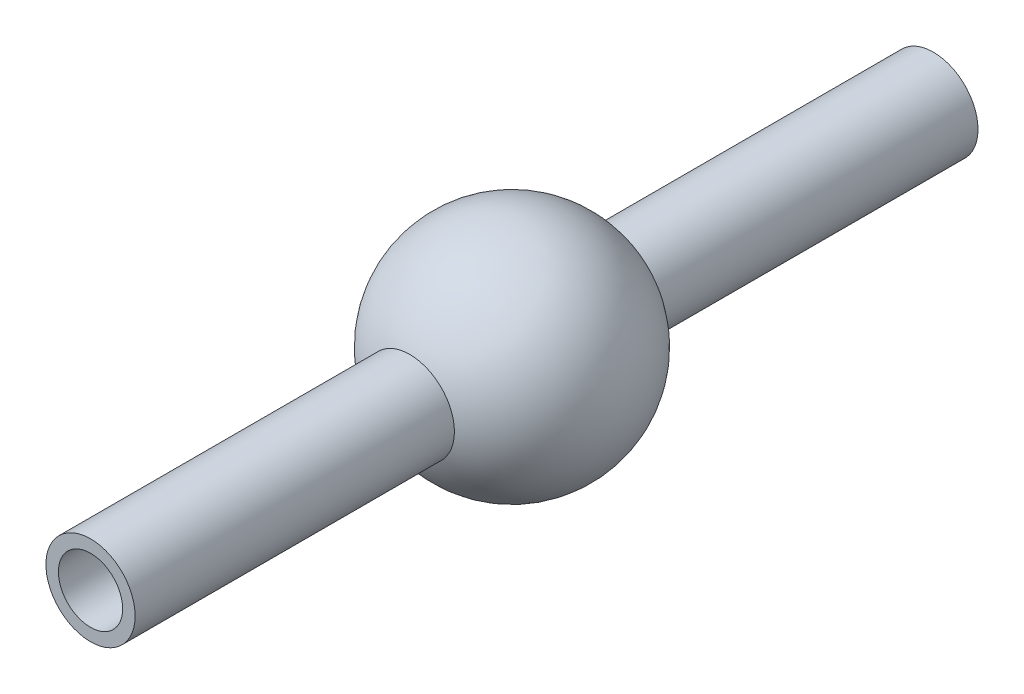
ISO-10303-21;
HEADER;
FILE_DESCRIPTION(('STEP AP214'),'2;1');
FILE_NAME('part.step','',(''),(''),'','','');
FILE_SCHEMA(('AUTOMOTIVE_DESIGN { 1 0 10303 214 1 1 1 1 }'));
ENDSEC;
DATA;
#1=APPLICATION_CONTEXT('core data for automotive mechanical design processes');
#2=APPLICATION_PROTOCOL_DEFINITION('international standard','automotive_design',2000,#1);
#3=PRODUCT_CONTEXT('',#1,'mechanical');
#4=PRODUCT('Part','Part','',(#3));
#5=PRODUCT_RELATED_PRODUCT_CATEGORY('part','',(#4));
#6=PRODUCT_DEFINITION_FORMATION('','',#4);
#7=PRODUCT_DEFINITION_CONTEXT('part definition',#1,'design');
#8=PRODUCT_DEFINITION('design','',#6,#7);
#9=PRODUCT_DEFINITION_SHAPE('','',#8);
#10=(LENGTH_UNIT() NAMED_UNIT(*) SI_UNIT(.MILLI.,.METRE.));
#11=(NAMED_UNIT(*) PLANE_ANGLE_UNIT() SI_UNIT($,.RADIAN.));
#12=(NAMED_UNIT(*) SI_UNIT($,.STERADIAN.) SOLID_ANGLE_UNIT());
#13=UNCERTAINTY_MEASURE_WITH_UNIT(LENGTH_MEASURE(1.E-05),#10,'distance_accuracy_value','');
#14=(GEOMETRIC_REPRESENTATION_CONTEXT(3) GLOBAL_UNCERTAINTY_ASSIGNED_CONTEXT((#13)) GLOBAL_UNIT_ASSIGNED_CONTEXT((#10,
#11,#12)) REPRESENTATION_CONTEXT('',''));
#15=CARTESIAN_POINT('',(0.,0.,0.));
#16=DIRECTION('',(0.,0.,1.));
#17=DIRECTION('',(1.,0.,0.));
#18=AXIS2_PLACEMENT_3D('',#15,#16,#17);
#19=CARTESIAN_POINT('',(0.,0.,-30.));
#20=DIRECTION('',(0.,0.,1.));
#21=DIRECTION('',(1.,0.,0.));
#22=AXIS2_PLACEMENT_3D('',#19,#20,#21);
#23=CYLINDRICAL_SURFACE('',#22,3.175);
#24=CARTESIAN_POINT('',(0.,0.,7.27211111026227));
#25=DIRECTION('',(0.,0.,-1.));
#26=DIRECTION('',(-1.,0.,0.));
#27=AXIS2_PLACEMENT_3D('',#24,#25,#26);
#28=CIRCLE('',#27,3.175);
#29=CARTESIAN_POINT('',(-3.17499999999998,0.,7.27211111026227));
#30=VERTEX_POINT('',#29);
#31=EDGE_CURVE('E10',#30,#30,#28,.F.);
#32=ORIENTED_EDGE('',*,*,#31,.T.);
#33=EDGE_LOOP('',(#32));
#34=FACE_BOUND('',#33,.T.);
#35=CARTESIAN_POINT('',(0.,0.,30.));
#36=DIRECTION('',(0.,0.,1.));
#37=DIRECTION('',(1.,0.,0.));
#38=AXIS2_PLACEMENT_3D('',#35,#36,#37);
#39=CIRCLE('',#38,3.175);
#40=CARTESIAN_POINT('',(3.175,0.,30.));
#41=VERTEX_POINT('',#40);
#42=EDGE_CURVE('E50',#41,#41,#39,.T.);
#43=ORIENTED_EDGE('',*,*,#42,.F.);
#44=EDGE_LOOP('',(#43));
#45=FACE_BOUND('',#44,.T.);
#46=ADVANCED_FACE('F30',(#34,#45),#23,.T.);
#47=CARTESIAN_POINT('',(0.,0.,-7.27211111026227));
#48=DIRECTION('',(0.,0.,1.));
#49=DIRECTION('',(1.,0.,0.));
#50=AXIS2_PLACEMENT_3D('',#47,#48,#49);
#51=CIRCLE('',#50,3.175);
#52=CARTESIAN_POINT('',(-3.17499999999998,0.,-7.27211111026227));
#53=VERTEX_POINT('',#52);
#54=EDGE_CURVE('E37',#53,#53,#51,.F.);
#55=ORIENTED_EDGE('',*,*,#54,.T.);
#56=EDGE_LOOP('',(#55));
#57=FACE_BOUND('',#56,.T.);
#58=CARTESIAN_POINT('',(0.,0.,-30.));
#59=DIRECTION('',(0.,0.,1.));
#60=DIRECTION('',(1.,0.,0.));
#61=AXIS2_PLACEMENT_3D('',#58,#59,#60);
#62=CIRCLE('',#61,3.175);
#63=CARTESIAN_POINT('',(3.175,0.,-30.));
#64=VERTEX_POINT('',#63);
#65=EDGE_CURVE('E41',#64,#64,#62,.T.);
#66=ORIENTED_EDGE('',*,*,#65,.T.);
#67=EDGE_LOOP('',(#66));
#68=FACE_BOUND('',#67,.T.);
#69=ADVANCED_FACE('F72',(#57,#68),#23,.T.);
#70=CARTESIAN_POINT('',(0.,0.,-30.));
#71=DIRECTION('',(0.,0.,1.));
#72=DIRECTION('',(1.,0.,0.));
#73=AXIS2_PLACEMENT_3D('',#70,#71,#72);
#74=PLANE('',#73);
#75=CARTESIAN_POINT('',(0.,0.,-30.));
#76=DIRECTION('',(0.,0.,1.));
#77=DIRECTION('',(1.,0.,0.));
#78=AXIS2_PLACEMENT_3D('',#75,#76,#77);
#79=CIRCLE('',#78,2.286);
#80=CARTESIAN_POINT('',(2.286,0.,-30.));
#81=VERTEX_POINT('',#80);
#82=EDGE_CURVE('E45',#81,#81,#79,.T.);
#83=ORIENTED_EDGE('',*,*,#82,.T.);
#84=EDGE_LOOP('',(#83));
#85=FACE_BOUND('',#84,.T.);
#86=ORIENTED_EDGE('',*,*,#65,.F.);
#87=EDGE_LOOP('',(#86));
#88=FACE_BOUND('',#87,.T.);
#89=ADVANCED_FACE('F68',(#85,#88),#74,.F.);
#90=CARTESIAN_POINT('',(0.,0.,-30.));
#91=DIRECTION('',(0.,0.,1.));
#92=DIRECTION('',(1.,0.,0.));
#93=AXIS2_PLACEMENT_3D('',#90,#91,#92);
#94=CYLINDRICAL_SURFACE('',#93,2.286);
#95=ORIENTED_EDGE('',*,*,#82,.F.);
#96=EDGE_LOOP('',(#95));
#97=FACE_BOUND('',#96,.T.);
#98=CARTESIAN_POINT('',(0.,0.,30.));
#99=DIRECTION('',(0.,0.,1.));
#100=DIRECTION('',(1.,0.,0.));
#101=AXIS2_PLACEMENT_3D('',#98,#99,#100);
#102=CIRCLE('',#101,2.286);
#103=CARTESIAN_POINT('',(2.286,0.,30.));
#104=VERTEX_POINT('',#103);
#105=EDGE_CURVE('E53',#104,#104,#102,.T.);
#106=ORIENTED_EDGE('',*,*,#105,.T.);
#107=EDGE_LOOP('',(#106));
#108=FACE_BOUND('',#107,.T.);
#109=ADVANCED_FACE('F57',(#97,#108),#94,.F.);
#110=CARTESIAN_POINT('',(0.,0.,30.));
#111=DIRECTION('',(0.,0.,1.));
#112=DIRECTION('',(1.,0.,0.));
#113=AXIS2_PLACEMENT_3D('',#110,#111,#112);
#114=PLANE('',#113);
#115=ORIENTED_EDGE('',*,*,#42,.T.);
#116=EDGE_LOOP('',(#115));
#117=FACE_BOUND('',#116,.T.);
#118=ORIENTED_EDGE('',*,*,#105,.F.);
#119=EDGE_LOOP('',(#118));
#120=FACE_BOUND('',#119,.T.);
#121=ADVANCED_FACE('F59',(#117,#120),#114,.T.);
#122=CARTESIAN_POINT('',(0.,0.,0.));
#123=DIRECTION('',(0.,0.,-1.));
#124=DIRECTION('',(-1.,0.,0.));
#125=AXIS2_PLACEMENT_3D('',#122,#123,#124);
#126=SPHERICAL_SURFACE('',#125,7.935);
#127=CARTESIAN_POINT('',(-3.17499999999998,0.,7.27211111026227));
#128=CARTESIAN_POINT('',(-3.35061875408827,0.,7.19545028966584));
#129=CARTESIAN_POINT('',(-3.52344842793918,0.,7.1124053788516));
#130=CARTESIAN_POINT('',(-3.86264964001569,0.,6.93403386141682));
#131=CARTESIAN_POINT('',(-4.0290211782413,0.,6.83870725479628));
#132=CARTESIAN_POINT('',(-4.35442614391668,0.,6.63625883037816));
#133=CARTESIAN_POINT('',(-4.51345957136645,0.,6.52913701258059));
#134=CARTESIAN_POINT('',(-4.82335591567039,0.,6.30366379476571));
#135=CARTESIAN_POINT('',(-4.97421883252457,0.,6.18531239474841));
#136=CARTESIAN_POINT('',(-5.26698218728775,0.,5.93799992787177));
#137=CARTESIAN_POINT('',(-5.40888262519677,0.,5.80903886101244));
#138=CARTESIAN_POINT('',(-5.68297672430484,0.,5.54118387560699));
#139=CARTESIAN_POINT('',(-5.81517038550391,0.,5.40228995706086));
#140=CARTESIAN_POINT('',(-6.0691573822966,0.,5.11529786085085));
#141=CARTESIAN_POINT('',(-6.19095071789022,0.,4.96719968318695));
#142=CARTESIAN_POINT('',(-6.42349812337256,0.,4.66257603752238));
#143=CARTESIAN_POINT('',(-6.53425219326128,0.,4.50605056952171));
#144=CARTESIAN_POINT('',(-6.74414002869085,0.,4.18539349921624));
#145=CARTESIAN_POINT('',(-6.84327379423171,0.,4.02126189691146));
#146=CARTESIAN_POINT('',(-7.02940094791239,0.,3.68625362358385));
#147=CARTESIAN_POINT('',(-7.11639433605221,0.,3.51537695256104));
#148=CARTESIAN_POINT('',(-7.27778435160517,0.,3.16777499152858));
#149=CARTESIAN_POINT('',(-7.3521809790183,0.,2.99104970151894));
#150=CARTESIAN_POINT('',(-7.48798717493117,0.,2.63267763562167));
#151=CARTESIAN_POINT('',(-7.5493967434309,0.,2.45103085973403));
#152=CARTESIAN_POINT('',(-7.65890665573856,0.,2.08376877407665));
#153=CARTESIAN_POINT('',(-7.7070069995465,0.,1.8981534643069));
#154=CARTESIAN_POINT('',(-7.78964611932276,0.,1.52392808256459));
#155=CARTESIAN_POINT('',(-7.82418489529109,0.,1.33531801059203));
#156=CARTESIAN_POINT('',(-7.87951968268696,0.,0.956092587181759));
#157=CARTESIAN_POINT('',(-7.9003156941145,0.,0.765477235744042));
#158=CARTESIAN_POINT('',(-7.92805585277101,0.,0.383241256204217));
#159=CARTESIAN_POINT('',(-7.93499999999998,0.,0.19162062810211));
#160=CARTESIAN_POINT('',(-7.93499999999998,0.,-0.191620628102105));
#161=CARTESIAN_POINT('',(-7.92805585277101,0.,-0.383241256204212));
#162=CARTESIAN_POINT('',(-7.9003156941145,0.,-0.765477235744037));
#163=CARTESIAN_POINT('',(-7.87951968268696,0.,-0.956092587181754));
#164=CARTESIAN_POINT('',(-7.82418489529109,0.,-1.33531801059203));
#165=CARTESIAN_POINT('',(-7.78964611932276,0.,-1.52392808256459));
#166=CARTESIAN_POINT('',(-7.7070069995465,0.,-1.8981534643069));
#167=CARTESIAN_POINT('',(-7.65890665573856,0.,-2.08376877407665));
#168=CARTESIAN_POINT('',(-7.5493967434309,0.,-2.45103085973403));
#169=CARTESIAN_POINT('',(-7.48798717493117,0.,-2.63267763562167));
#170=CARTESIAN_POINT('',(-7.35218097901831,0.,-2.99104970151894));
#171=CARTESIAN_POINT('',(-7.27778435160517,0.,-3.16777499152858));
#172=CARTESIAN_POINT('',(-7.11639433605221,0.,-3.51537695256104));
#173=CARTESIAN_POINT('',(-7.02940094791239,0.,-3.68625362358385));
#174=CARTESIAN_POINT('',(-6.84327379423171,0.,-4.02126189691145));
#175=CARTESIAN_POINT('',(-6.74414002869085,0.,-4.18539349921624));
#176=CARTESIAN_POINT('',(-6.53425219326128,0.,-4.5060505695217));
#177=CARTESIAN_POINT('',(-6.42349812337256,0.,-4.66257603752238));
#178=CARTESIAN_POINT('',(-6.19095071789022,0.,-4.96719968318695));
#179=CARTESIAN_POINT('',(-6.0691573822966,0.,-5.11529786085084));
#180=CARTESIAN_POINT('',(-5.81517038550391,0.,-5.40228995706086));
#181=CARTESIAN_POINT('',(-5.68297672430485,0.,-5.54118387560699));
#182=CARTESIAN_POINT('',(-5.40888262519677,0.,-5.80903886101244));
#183=CARTESIAN_POINT('',(-5.26698218728776,0.,-5.93799992787177));
#184=CARTESIAN_POINT('',(-4.97421883252457,0.,-6.1853123947484));
#185=CARTESIAN_POINT('',(-4.8233559156704,0.,-6.30366379476571));
#186=CARTESIAN_POINT('',(-4.51345957136645,0.,-6.52913701258059));
#187=CARTESIAN_POINT('',(-4.35442614391668,0.,-6.63625883037816));
#188=CARTESIAN_POINT('',(-4.02902117824131,0.,-6.83870725479628));
#189=CARTESIAN_POINT('',(-3.8626496400157,0.,-6.93403386141682));
#190=CARTESIAN_POINT('',(-3.52344842793918,0.,-7.1124053788516));
#191=CARTESIAN_POINT('',(-3.35061875408827,0.,-7.19545028966583));
#192=CARTESIAN_POINT('',(-3.17499999999998,0.,-7.27211111026227));
#193=B_SPLINE_CURVE_WITH_KNOTS('',3,(#127,#128,#129,#130,#131,#132,#133,#134,#135,#136,#137,
#138,#139,#140,#141,#142,#143,#144,#145,#146,#147,#148,#149,#150,#151,#152,#153,#154,#155,#156,
#157,#158,#159,#160,#161,#162,#163,#164,#165,#166,#167,#168,#169,#170,#171,#172,#173,#174,#175,
#176,#177,#178,#179,#180,#181,#182,#183,#184,#185,#186,#187,#188,#189,#190,#191,#192),
.UNSPECIFIED.,.F.,.F.,(4,2,2,2,2,2,2,2,2,2,2,2,2,2,2,2,2,2,2,2,2,2,2,2,2,2,2,2,2,2,2,2,4),(0.,
0.574736266006542,1.14947253201308,1.72420879801962,2.29894506402617,2.87368133003271,
3.44841759603925,4.02315386204579,4.59789012805234,5.17262639405888,5.74736266006542,
6.32209892607196,6.8968351920785,7.47157145808505,8.04630772409159,8.62104399009813,
9.19578025610467,9.77051652211121,10.3452527881178,10.9199890541243,11.4947253201308,
12.0694615861374,12.6441978521439,13.2189341181505,13.793670384157,14.3684066501635,
14.9431429161701,15.5178791821766,16.0926154481832,16.6673517141897,17.2420879801963,
17.8168242462028,18.3915605122093),.UNSPECIFIED.);
#194=EDGE_CURVE('BSEAM32',#30,#53,#193,.T.);
#195=ORIENTED_EDGE('',*,*,#31,.F.);
#196=ORIENTED_EDGE('',*,*,#54,.F.);
#197=ORIENTED_EDGE('',*,*,#194,.T.);
#198=ORIENTED_EDGE('',*,*,#194,.F.);
#199=EDGE_LOOP('',(#195,#197,#196,#198));
#200=FACE_BOUND('',#199,.T.);
#201=ADVANCED_FACE('F32',(#200),#126,.T.);
#202=CLOSED_SHELL('',(#46,#69,#89,#109,#121,#201));
#203=MANIFOLD_SOLID_BREP('B2',#202);
#204=ADVANCED_BREP_SHAPE_REPRESENTATION('',(#18,#203),#14);
#205=SHAPE_DEFINITION_REPRESENTATION(#9,#204);
ENDSEC;
END-ISO-10303-21;
